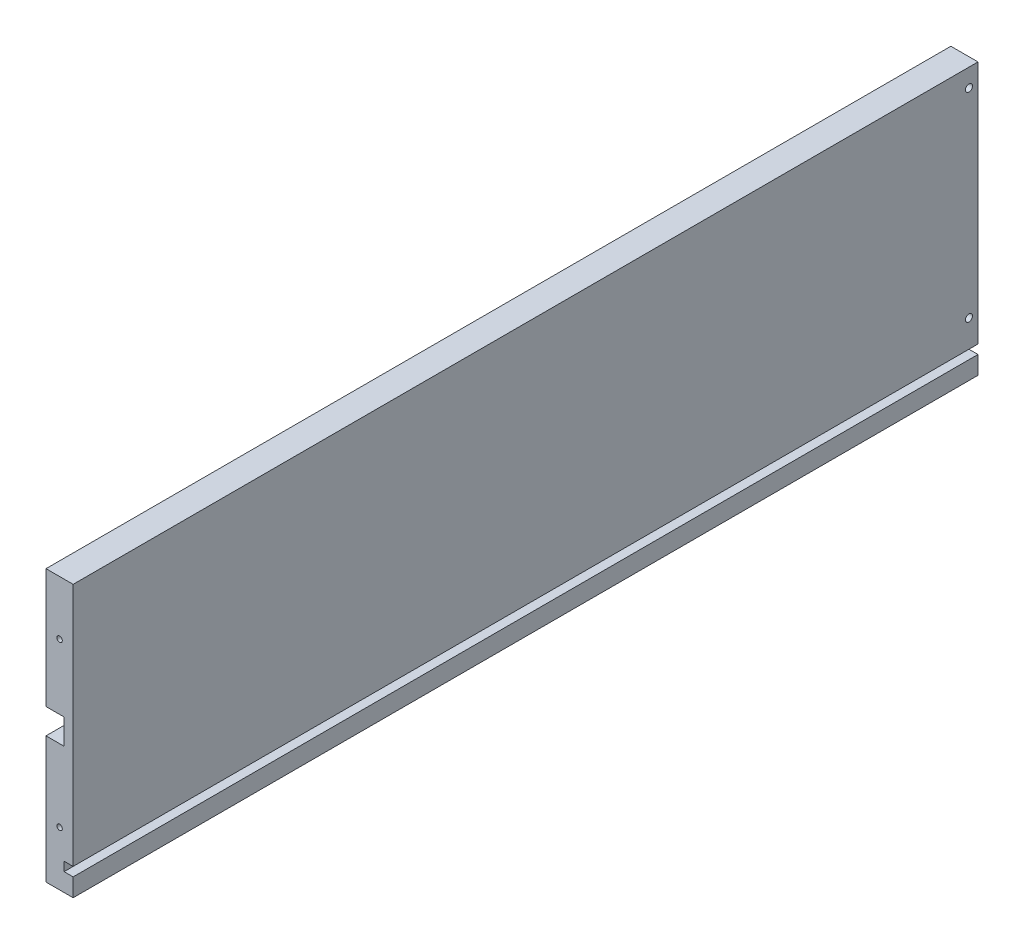
ISO-10303-21;
HEADER;
FILE_DESCRIPTION(('STEP AP214'),'2;1');
FILE_NAME('part.step','',(''),(''),'','','');
FILE_SCHEMA(('AUTOMOTIVE_DESIGN { 1 0 10303 214 1 1 1 1 }'));
ENDSEC;
DATA;
#1=APPLICATION_CONTEXT('core data for automotive mechanical design processes');
#2=APPLICATION_PROTOCOL_DEFINITION('international standard','automotive_design',2000,#1);
#3=PRODUCT_CONTEXT('',#1,'mechanical');
#4=PRODUCT('Part','Part','',(#3));
#5=PRODUCT_RELATED_PRODUCT_CATEGORY('part','',(#4));
#6=PRODUCT_DEFINITION_FORMATION('','',#4);
#7=PRODUCT_DEFINITION_CONTEXT('part definition',#1,'design');
#8=PRODUCT_DEFINITION('design','',#6,#7);
#9=PRODUCT_DEFINITION_SHAPE('','',#8);
#10=(LENGTH_UNIT() NAMED_UNIT(*) SI_UNIT(.MILLI.,.METRE.));
#11=(NAMED_UNIT(*) PLANE_ANGLE_UNIT() SI_UNIT($,.RADIAN.));
#12=(NAMED_UNIT(*) SI_UNIT($,.STERADIAN.) SOLID_ANGLE_UNIT());
#13=UNCERTAINTY_MEASURE_WITH_UNIT(LENGTH_MEASURE(1.E-05),#10,'distance_accuracy_value','');
#14=(GEOMETRIC_REPRESENTATION_CONTEXT(3) GLOBAL_UNCERTAINTY_ASSIGNED_CONTEXT((#13)) GLOBAL_UNIT_ASSIGNED_CONTEXT((#10,
#11,#12)) REPRESENTATION_CONTEXT('',''));
#15=CARTESIAN_POINT('',(0.,0.,0.));
#16=DIRECTION('',(0.,0.,1.));
#17=DIRECTION('',(1.,0.,0.));
#18=AXIS2_PLACEMENT_3D('',#15,#16,#17);
#19=CARTESIAN_POINT('',(15.,150.,0.));
#20=DIRECTION('',(1.,0.,0.));
#21=DIRECTION('',(0.,0.,1.));
#22=AXIS2_PLACEMENT_3D('',#19,#20,#21);
#23=PLANE('',#22);
#24=CARTESIAN_POINT('',(15.,140.,-495.));
#25=DIRECTION('',(1.,0.,0.));
#26=DIRECTION('',(0.,0.,-1.));
#27=AXIS2_PLACEMENT_3D('',#24,#25,#26);
#28=CIRCLE('',#27,1.95000000000001);
#29=CARTESIAN_POINT('',(15.,140.,-496.95));
#30=VERTEX_POINT('',#29);
#31=EDGE_CURVE('E152',#30,#30,#28,.T.);
#32=ORIENTED_EDGE('',*,*,#31,.F.);
#33=EDGE_LOOP('',(#32));
#34=FACE_BOUND('',#33,.T.);
#35=CARTESIAN_POINT('',(15.,30.,-495.));
#36=DIRECTION('',(1.,0.,0.));
#37=DIRECTION('',(0.,0.,-1.));
#38=AXIS2_PLACEMENT_3D('',#35,#36,#37);
#39=CIRCLE('',#38,1.94999999999999);
#40=CARTESIAN_POINT('',(15.,30.,-496.95));
#41=VERTEX_POINT('',#40);
#42=EDGE_CURVE('E161',#41,#41,#39,.T.);
#43=ORIENTED_EDGE('',*,*,#42,.F.);
#44=EDGE_LOOP('',(#43));
#45=FACE_BOUND('',#44,.T.);
#46=DIRECTION('',(0.,0.,1.));
#47=VECTOR('',#46,1.);
#48=CARTESIAN_POINT('',(15.,15.,-500.));
#49=LINE('',#48,#47);
#50=CARTESIAN_POINT('',(15.,15.,-500.));
#51=VERTEX_POINT('',#50);
#52=CARTESIAN_POINT('',(15.,15.,0.));
#53=VERTEX_POINT('',#52);
#54=EDGE_CURVE('E185',#51,#53,#49,.T.);
#55=ORIENTED_EDGE('',*,*,#54,.F.);
#56=DIRECTION('',(0.,1.,0.));
#57=VECTOR('',#56,1.);
#58=CARTESIAN_POINT('',(15.,0.,-500.));
#59=LINE('',#58,#57);
#60=CARTESIAN_POINT('',(15.,150.,-500.));
#61=VERTEX_POINT('',#60);
#62=EDGE_CURVE('E223',#51,#61,#59,.T.);
#63=ORIENTED_EDGE('',*,*,#62,.T.);
#64=DIRECTION('',(0.,0.,1.));
#65=VECTOR('',#64,1.);
#66=CARTESIAN_POINT('',(15.,150.,0.));
#67=LINE('',#66,#65);
#68=CARTESIAN_POINT('',(15.,150.,0.));
#69=VERTEX_POINT('',#68);
#70=EDGE_CURVE('E226',#61,#69,#67,.T.);
#71=ORIENTED_EDGE('',*,*,#70,.T.);
#72=DIRECTION('',(0.,-1.,0.));
#73=VECTOR('',#72,1.);
#74=CARTESIAN_POINT('',(15.,0.,0.));
#75=LINE('',#74,#73);
#76=EDGE_CURVE('E217',#69,#53,#75,.T.);
#77=ORIENTED_EDGE('',*,*,#76,.T.);
#78=EDGE_LOOP('',(#55,#63,#71,#77));
#79=FACE_BOUND('',#78,.T.);
#80=ADVANCED_FACE('F35',(#34,#45,#79),#23,.T.);
#81=CARTESIAN_POINT('',(0.,150.,0.));
#82=DIRECTION('',(1.,0.,0.));
#83=DIRECTION('',(0.,0.,1.));
#84=AXIS2_PLACEMENT_3D('',#81,#82,#83);
#85=PLANE('',#84);
#86=CARTESIAN_POINT('',(0.,30.,-495.));
#87=DIRECTION('',(1.,0.,0.));
#88=DIRECTION('',(0.,0.,-1.));
#89=AXIS2_PLACEMENT_3D('',#86,#87,#88);
#90=CIRCLE('',#89,4.1);
#91=CARTESIAN_POINT('',(0.,30.,-499.1));
#92=VERTEX_POINT('',#91);
#93=EDGE_CURVE('E167',#92,#92,#90,.T.);
#94=ORIENTED_EDGE('',*,*,#93,.T.);
#95=EDGE_LOOP('',(#94));
#96=FACE_BOUND('',#95,.T.);
#97=DIRECTION('',(0.,1.,0.));
#98=VECTOR('',#97,1.);
#99=CARTESIAN_POINT('',(0.,0.,-500.));
#100=LINE('',#99,#98);
#101=CARTESIAN_POINT('',(0.,0.,-500.));
#102=VERTEX_POINT('',#101);
#103=CARTESIAN_POINT('',(0.,70.,-500.));
#104=VERTEX_POINT('',#103);
#105=EDGE_CURVE('E236',#102,#104,#100,.T.);
#106=ORIENTED_EDGE('',*,*,#105,.F.);
#107=DIRECTION('',(0.,0.,-1.));
#108=VECTOR('',#107,1.);
#109=CARTESIAN_POINT('',(0.,0.,0.));
#110=LINE('',#109,#108);
#111=CARTESIAN_POINT('',(0.,0.,0.));
#112=VERTEX_POINT('',#111);
#113=EDGE_CURVE('E232',#112,#102,#110,.T.);
#114=ORIENTED_EDGE('',*,*,#113,.F.);
#115=DIRECTION('',(0.,-1.,0.));
#116=VECTOR('',#115,1.);
#117=CARTESIAN_POINT('',(0.,0.,0.));
#118=LINE('',#117,#116);
#119=CARTESIAN_POINT('',(0.,70.,0.));
#120=VERTEX_POINT('',#119);
#121=EDGE_CURVE('E211',#120,#112,#118,.T.);
#122=ORIENTED_EDGE('',*,*,#121,.F.);
#123=DIRECTION('',(0.,0.,1.));
#124=VECTOR('',#123,1.);
#125=CARTESIAN_POINT('',(0.,70.,-500.));
#126=LINE('',#125,#124);
#127=EDGE_CURVE('E208',#104,#120,#126,.T.);
#128=ORIENTED_EDGE('',*,*,#127,.F.);
#129=EDGE_LOOP('',(#106,#114,#122,#128));
#130=FACE_BOUND('',#129,.T.);
#131=ADVANCED_FACE('F259',(#96,#130),#85,.F.);
#132=CARTESIAN_POINT('',(15.,0.,0.));
#133=DIRECTION('',(0.,0.,1.));
#134=DIRECTION('',(-1.,0.,0.));
#135=AXIS2_PLACEMENT_3D('',#132,#133,#134);
#136=PLANE('',#135);
#137=CARTESIAN_POINT('',(7.5,30.,0.));
#138=DIRECTION('',(0.,0.,-1.));
#139=DIRECTION('',(-1.,0.,0.));
#140=AXIS2_PLACEMENT_3D('',#137,#138,#139);
#141=CIRCLE('',#140,1.5);
#142=CARTESIAN_POINT('',(6.00000000000001,30.,0.));
#143=VERTEX_POINT('',#142);
#144=EDGE_CURVE('E141',#143,#143,#141,.T.);
#145=ORIENTED_EDGE('',*,*,#144,.T.);
#146=EDGE_LOOP('',(#145));
#147=FACE_BOUND('',#146,.T.);
#148=CARTESIAN_POINT('',(7.50000000000001,120.,0.));
#149=DIRECTION('',(0.,0.,-1.));
#150=DIRECTION('',(-1.,0.,0.));
#151=AXIS2_PLACEMENT_3D('',#148,#149,#150);
#152=CIRCLE('',#151,1.5);
#153=CARTESIAN_POINT('',(6.00000000000002,120.,0.));
#154=VERTEX_POINT('',#153);
#155=EDGE_CURVE('E149',#154,#154,#152,.T.);
#156=ORIENTED_EDGE('',*,*,#155,.T.);
#157=EDGE_LOOP('',(#156));
#158=FACE_BOUND('',#157,.T.);
#159=DIRECTION('',(1.,0.,0.));
#160=VECTOR('',#159,1.);
#161=CARTESIAN_POINT('',(15.,15.,0.));
#162=LINE('',#161,#160);
#163=CARTESIAN_POINT('',(10.,15.,0.));
#164=VERTEX_POINT('',#163);
#165=EDGE_CURVE('E174',#164,#53,#162,.T.);
#166=ORIENTED_EDGE('',*,*,#165,.T.);
#167=ORIENTED_EDGE('',*,*,#76,.F.);
#168=DIRECTION('',(-1.,0.,0.));
#169=VECTOR('',#168,1.);
#170=CARTESIAN_POINT('',(15.,150.,0.));
#171=LINE('',#170,#169);
#172=CARTESIAN_POINT('',(0.,150.,0.));
#173=VERTEX_POINT('',#172);
#174=EDGE_CURVE('E11',#69,#173,#171,.T.);
#175=ORIENTED_EDGE('',*,*,#174,.T.);
#176=CARTESIAN_POINT('',(0.,84.,0.));
#177=VERTEX_POINT('',#176);
#178=EDGE_CURVE('E229',#173,#177,#118,.T.);
#179=ORIENTED_EDGE('',*,*,#178,.T.);
#180=DIRECTION('',(1.,0.,0.));
#181=VECTOR('',#180,1.);
#182=CARTESIAN_POINT('',(0.,84.,0.));
#183=LINE('',#182,#181);
#184=CARTESIAN_POINT('',(10.,84.,0.));
#185=VERTEX_POINT('',#184);
#186=EDGE_CURVE('E188',#177,#185,#183,.T.);
#187=ORIENTED_EDGE('',*,*,#186,.T.);
#188=DIRECTION('',(0.,-1.,0.));
#189=VECTOR('',#188,1.);
#190=CARTESIAN_POINT('',(10.,70.,0.));
#191=LINE('',#190,#189);
#192=CARTESIAN_POINT('',(10.,70.,0.));
#193=VERTEX_POINT('',#192);
#194=EDGE_CURVE('E204',#185,#193,#191,.T.);
#195=ORIENTED_EDGE('',*,*,#194,.T.);
#196=DIRECTION('',(-1.,0.,0.));
#197=VECTOR('',#196,1.);
#198=CARTESIAN_POINT('',(0.,70.,0.));
#199=LINE('',#198,#197);
#200=EDGE_CURVE('E197',#193,#120,#199,.T.);
#201=ORIENTED_EDGE('',*,*,#200,.T.);
#202=ORIENTED_EDGE('',*,*,#121,.T.);
#203=DIRECTION('',(-1.,0.,0.));
#204=VECTOR('',#203,1.);
#205=CARTESIAN_POINT('',(15.,0.,0.));
#206=LINE('',#205,#204);
#207=CARTESIAN_POINT('',(15.,0.,0.));
#208=VERTEX_POINT('',#207);
#209=EDGE_CURVE('E39',#208,#112,#206,.T.);
#210=ORIENTED_EDGE('',*,*,#209,.F.);
#211=CARTESIAN_POINT('',(15.,10.,0.));
#212=VERTEX_POINT('',#211);
#213=EDGE_CURVE('E221',#212,#208,#75,.T.);
#214=ORIENTED_EDGE('',*,*,#213,.F.);
#215=DIRECTION('',(-1.,0.,0.));
#216=VECTOR('',#215,1.);
#217=CARTESIAN_POINT('',(15.,10.,0.));
#218=LINE('',#217,#216);
#219=CARTESIAN_POINT('',(10.,10.,0.));
#220=VERTEX_POINT('',#219);
#221=EDGE_CURVE('E170',#212,#220,#218,.T.);
#222=ORIENTED_EDGE('',*,*,#221,.T.);
#223=DIRECTION('',(0.,1.,0.));
#224=VECTOR('',#223,1.);
#225=CARTESIAN_POINT('',(10.,10.,0.));
#226=LINE('',#225,#224);
#227=EDGE_CURVE('E181',#220,#164,#226,.T.);
#228=ORIENTED_EDGE('',*,*,#227,.T.);
#229=EDGE_LOOP('',(#166,#167,#175,#179,#187,#195,#201,#202,#210,#214,#222,#228));
#230=FACE_BOUND('',#229,.T.);
#231=ADVANCED_FACE('F37',(#147,#158,#230),#136,.T.);
#232=CARTESIAN_POINT('',(15.,150.,0.));
#233=DIRECTION('',(0.,1.,0.));
#234=DIRECTION('',(0.,0.,1.));
#235=AXIS2_PLACEMENT_3D('',#232,#233,#234);
#236=PLANE('',#235);
#237=DIRECTION('',(0.,0.,1.));
#238=VECTOR('',#237,1.);
#239=CARTESIAN_POINT('',(0.,150.,0.));
#240=LINE('',#239,#238);
#241=CARTESIAN_POINT('',(0.,150.,-500.));
#242=VERTEX_POINT('',#241);
#243=EDGE_CURVE('E239',#242,#173,#240,.T.);
#244=ORIENTED_EDGE('',*,*,#243,.T.);
#245=ORIENTED_EDGE('',*,*,#174,.F.);
#246=ORIENTED_EDGE('',*,*,#70,.F.);
#247=DIRECTION('',(-1.,0.,0.));
#248=VECTOR('',#247,1.);
#249=CARTESIAN_POINT('',(15.,150.,-500.));
#250=LINE('',#249,#248);
#251=EDGE_CURVE('E44',#61,#242,#250,.T.);
#252=ORIENTED_EDGE('',*,*,#251,.T.);
#253=EDGE_LOOP('',(#244,#245,#246,#252));
#254=FACE_BOUND('',#253,.T.);
#255=ADVANCED_FACE('F276',(#254),#236,.T.);
#256=CARTESIAN_POINT('',(15.,0.,-500.));
#257=DIRECTION('',(0.,0.,-1.));
#258=DIRECTION('',(1.,0.,0.));
#259=AXIS2_PLACEMENT_3D('',#256,#257,#258);
#260=PLANE('',#259);
#261=DIRECTION('',(1.,0.,0.));
#262=VECTOR('',#261,1.);
#263=CARTESIAN_POINT('',(15.,15.,-500.));
#264=LINE('',#263,#262);
#265=CARTESIAN_POINT('',(10.,15.,-500.));
#266=VERTEX_POINT('',#265);
#267=EDGE_CURVE('E177',#266,#51,#264,.T.);
#268=ORIENTED_EDGE('',*,*,#267,.F.);
#269=DIRECTION('',(0.,1.,0.));
#270=VECTOR('',#269,1.);
#271=CARTESIAN_POINT('',(10.,10.,-500.));
#272=LINE('',#271,#270);
#273=CARTESIAN_POINT('',(10.,10.,-500.));
#274=VERTEX_POINT('',#273);
#275=EDGE_CURVE('E173',#274,#266,#272,.T.);
#276=ORIENTED_EDGE('',*,*,#275,.F.);
#277=DIRECTION('',(-1.,0.,0.));
#278=VECTOR('',#277,1.);
#279=CARTESIAN_POINT('',(15.,10.,-500.));
#280=LINE('',#279,#278);
#281=CARTESIAN_POINT('',(15.,10.,-500.));
#282=VERTEX_POINT('',#281);
#283=EDGE_CURVE('E171',#282,#274,#280,.T.);
#284=ORIENTED_EDGE('',*,*,#283,.F.);
#285=CARTESIAN_POINT('',(15.,0.,-500.));
#286=VERTEX_POINT('',#285);
#287=EDGE_CURVE('E224',#286,#282,#59,.T.);
#288=ORIENTED_EDGE('',*,*,#287,.F.);
#289=DIRECTION('',(-1.,0.,0.));
#290=VECTOR('',#289,1.);
#291=CARTESIAN_POINT('',(15.,0.,-500.));
#292=LINE('',#291,#290);
#293=EDGE_CURVE('E242',#286,#102,#292,.T.);
#294=ORIENTED_EDGE('',*,*,#293,.T.);
#295=ORIENTED_EDGE('',*,*,#105,.T.);
#296=DIRECTION('',(-1.,0.,0.));
#297=VECTOR('',#296,1.);
#298=CARTESIAN_POINT('',(0.,70.,-500.));
#299=LINE('',#298,#297);
#300=CARTESIAN_POINT('',(10.,70.,-500.));
#301=VERTEX_POINT('',#300);
#302=EDGE_CURVE('E200',#301,#104,#299,.T.);
#303=ORIENTED_EDGE('',*,*,#302,.F.);
#304=DIRECTION('',(0.,-1.,0.));
#305=VECTOR('',#304,1.);
#306=CARTESIAN_POINT('',(10.,70.,-500.));
#307=LINE('',#306,#305);
#308=CARTESIAN_POINT('',(10.,84.,-500.));
#309=VERTEX_POINT('',#308);
#310=EDGE_CURVE('E196',#309,#301,#307,.T.);
#311=ORIENTED_EDGE('',*,*,#310,.F.);
#312=DIRECTION('',(1.,0.,0.));
#313=VECTOR('',#312,1.);
#314=CARTESIAN_POINT('',(0.,84.,-500.));
#315=LINE('',#314,#313);
#316=CARTESIAN_POINT('',(0.,84.,-500.));
#317=VERTEX_POINT('',#316);
#318=EDGE_CURVE('E194',#317,#309,#315,.T.);
#319=ORIENTED_EDGE('',*,*,#318,.F.);
#320=EDGE_CURVE('E235',#317,#242,#100,.T.);
#321=ORIENTED_EDGE('',*,*,#320,.T.);
#322=ORIENTED_EDGE('',*,*,#251,.F.);
#323=ORIENTED_EDGE('',*,*,#62,.F.);
#324=EDGE_LOOP('',(#268,#276,#284,#288,#294,#295,#303,#311,#319,#321,#322,#323));
#325=FACE_BOUND('',#324,.T.);
#326=ADVANCED_FACE('F262',(#325),#260,.T.);
#327=CARTESIAN_POINT('',(15.,0.,0.));
#328=DIRECTION('',(0.,-1.,0.));
#329=DIRECTION('',(0.,0.,-1.));
#330=AXIS2_PLACEMENT_3D('',#327,#328,#329);
#331=PLANE('',#330);
#332=ORIENTED_EDGE('',*,*,#113,.T.);
#333=ORIENTED_EDGE('',*,*,#293,.F.);
#334=DIRECTION('',(0.,0.,-1.));
#335=VECTOR('',#334,1.);
#336=CARTESIAN_POINT('',(15.,0.,0.));
#337=LINE('',#336,#335);
#338=EDGE_CURVE('E220',#208,#286,#337,.T.);
#339=ORIENTED_EDGE('',*,*,#338,.F.);
#340=ORIENTED_EDGE('',*,*,#209,.T.);
#341=EDGE_LOOP('',(#332,#333,#339,#340));
#342=FACE_BOUND('',#341,.T.);
#343=ADVANCED_FACE('F249',(#342),#331,.T.);
#344=DIRECTION('',(0.,0.,1.));
#345=VECTOR('',#344,1.);
#346=CARTESIAN_POINT('',(15.,10.,-500.));
#347=LINE('',#346,#345);
#348=EDGE_CURVE('E52',#282,#212,#347,.T.);
#349=ORIENTED_EDGE('',*,*,#348,.T.);
#350=ORIENTED_EDGE('',*,*,#213,.T.);
#351=ORIENTED_EDGE('',*,*,#338,.T.);
#352=ORIENTED_EDGE('',*,*,#287,.T.);
#353=EDGE_LOOP('',(#349,#350,#351,#352));
#354=FACE_BOUND('',#353,.T.);
#355=ADVANCED_FACE('F293',(#354),#23,.T.);
#356=CARTESIAN_POINT('',(0.,140.,-495.));
#357=DIRECTION('',(1.,0.,0.));
#358=DIRECTION('',(0.,0.,-1.));
#359=AXIS2_PLACEMENT_3D('',#356,#357,#358);
#360=CIRCLE('',#359,4.09999999999999);
#361=CARTESIAN_POINT('',(0.,140.,-499.1));
#362=VERTEX_POINT('',#361);
#363=EDGE_CURVE('E158',#362,#362,#360,.T.);
#364=ORIENTED_EDGE('',*,*,#363,.T.);
#365=EDGE_LOOP('',(#364));
#366=FACE_BOUND('',#365,.T.);
#367=ORIENTED_EDGE('',*,*,#178,.F.);
#368=ORIENTED_EDGE('',*,*,#243,.F.);
#369=ORIENTED_EDGE('',*,*,#320,.F.);
#370=DIRECTION('',(0.,0.,1.));
#371=VECTOR('',#370,1.);
#372=CARTESIAN_POINT('',(0.,84.,-500.));
#373=LINE('',#372,#371);
#374=EDGE_CURVE('E60',#317,#177,#373,.T.);
#375=ORIENTED_EDGE('',*,*,#374,.T.);
#376=EDGE_LOOP('',(#367,#368,#369,#375));
#377=FACE_BOUND('',#376,.T.);
#378=ADVANCED_FACE('F279',(#366,#377),#85,.F.);
#379=CARTESIAN_POINT('',(0.,70.,-500.));
#380=DIRECTION('',(0.,-1.,0.));
#381=DIRECTION('',(0.,0.,-1.));
#382=AXIS2_PLACEMENT_3D('',#379,#380,#381);
#383=PLANE('',#382);
#384=ORIENTED_EDGE('',*,*,#200,.F.);
#385=DIRECTION('',(0.,0.,1.));
#386=VECTOR('',#385,1.);
#387=CARTESIAN_POINT('',(10.,70.,-500.));
#388=LINE('',#387,#386);
#389=EDGE_CURVE('E212',#301,#193,#388,.T.);
#390=ORIENTED_EDGE('',*,*,#389,.F.);
#391=ORIENTED_EDGE('',*,*,#302,.T.);
#392=ORIENTED_EDGE('',*,*,#127,.T.);
#393=EDGE_LOOP('',(#384,#390,#391,#392));
#394=FACE_BOUND('',#393,.T.);
#395=ADVANCED_FACE('F266',(#394),#383,.F.);
#396=CARTESIAN_POINT('',(10.,70.,-500.));
#397=DIRECTION('',(1.,0.,0.));
#398=DIRECTION('',(0.,0.,1.));
#399=AXIS2_PLACEMENT_3D('',#396,#397,#398);
#400=PLANE('',#399);
#401=ORIENTED_EDGE('',*,*,#194,.F.);
#402=DIRECTION('',(0.,0.,1.));
#403=VECTOR('',#402,1.);
#404=CARTESIAN_POINT('',(10.,84.,-500.));
#405=LINE('',#404,#403);
#406=EDGE_CURVE('E214',#309,#185,#405,.T.);
#407=ORIENTED_EDGE('',*,*,#406,.F.);
#408=ORIENTED_EDGE('',*,*,#310,.T.);
#409=ORIENTED_EDGE('',*,*,#389,.T.);
#410=EDGE_LOOP('',(#401,#407,#408,#409));
#411=FACE_BOUND('',#410,.T.);
#412=ADVANCED_FACE('F269',(#411),#400,.F.);
#413=CARTESIAN_POINT('',(0.,84.,-500.));
#414=DIRECTION('',(0.,1.,0.));
#415=DIRECTION('',(0.,0.,1.));
#416=AXIS2_PLACEMENT_3D('',#413,#414,#415);
#417=PLANE('',#416);
#418=ORIENTED_EDGE('',*,*,#186,.F.);
#419=ORIENTED_EDGE('',*,*,#374,.F.);
#420=ORIENTED_EDGE('',*,*,#318,.T.);
#421=ORIENTED_EDGE('',*,*,#406,.T.);
#422=EDGE_LOOP('',(#418,#419,#420,#421));
#423=FACE_BOUND('',#422,.T.);
#424=ADVANCED_FACE('F270',(#423),#417,.F.);
#425=CARTESIAN_POINT('',(15.,15.,-500.));
#426=DIRECTION('',(0.,1.,0.));
#427=DIRECTION('',(0.,0.,1.));
#428=AXIS2_PLACEMENT_3D('',#425,#426,#427);
#429=PLANE('',#428);
#430=ORIENTED_EDGE('',*,*,#165,.F.);
#431=DIRECTION('',(0.,0.,1.));
#432=VECTOR('',#431,1.);
#433=CARTESIAN_POINT('',(10.,15.,-500.));
#434=LINE('',#433,#432);
#435=EDGE_CURVE('E189',#266,#164,#434,.T.);
#436=ORIENTED_EDGE('',*,*,#435,.F.);
#437=ORIENTED_EDGE('',*,*,#267,.T.);
#438=ORIENTED_EDGE('',*,*,#54,.T.);
#439=EDGE_LOOP('',(#430,#436,#437,#438));
#440=FACE_BOUND('',#439,.T.);
#441=ADVANCED_FACE('F287',(#440),#429,.F.);
#442=CARTESIAN_POINT('',(10.,10.,-500.));
#443=DIRECTION('',(-1.,0.,0.));
#444=DIRECTION('',(0.,0.,-1.));
#445=AXIS2_PLACEMENT_3D('',#442,#443,#444);
#446=PLANE('',#445);
#447=ORIENTED_EDGE('',*,*,#227,.F.);
#448=DIRECTION('',(0.,0.,1.));
#449=VECTOR('',#448,1.);
#450=CARTESIAN_POINT('',(10.,10.,-500.));
#451=LINE('',#450,#449);
#452=EDGE_CURVE('E191',#274,#220,#451,.T.);
#453=ORIENTED_EDGE('',*,*,#452,.F.);
#454=ORIENTED_EDGE('',*,*,#275,.T.);
#455=ORIENTED_EDGE('',*,*,#435,.T.);
#456=EDGE_LOOP('',(#447,#453,#454,#455));
#457=FACE_BOUND('',#456,.T.);
#458=ADVANCED_FACE('F290',(#457),#446,.F.);
#459=CARTESIAN_POINT('',(15.,10.,-500.));
#460=DIRECTION('',(0.,-1.,0.));
#461=DIRECTION('',(-1.,0.,0.));
#462=AXIS2_PLACEMENT_3D('',#459,#460,#461);
#463=PLANE('',#462);
#464=ORIENTED_EDGE('',*,*,#221,.F.);
#465=ORIENTED_EDGE('',*,*,#348,.F.);
#466=ORIENTED_EDGE('',*,*,#283,.T.);
#467=ORIENTED_EDGE('',*,*,#452,.T.);
#468=EDGE_LOOP('',(#464,#465,#466,#467));
#469=FACE_BOUND('',#468,.T.);
#470=ADVANCED_FACE('F291',(#469),#463,.F.);
#471=CARTESIAN_POINT('',(0.,30.,-495.));
#472=DIRECTION('',(-1.,0.,0.));
#473=DIRECTION('',(0.,0.,-1.));
#474=AXIS2_PLACEMENT_3D('',#471,#472,#473);
#475=CONICAL_SURFACE('',#474,4.1,0.785398163397448);
#476=CARTESIAN_POINT('',(2.15,30.,-495.));
#477=DIRECTION('',(1.,0.,0.));
#478=DIRECTION('',(0.,0.,-1.));
#479=AXIS2_PLACEMENT_3D('',#476,#477,#478);
#480=CIRCLE('',#479,1.95);
#481=CARTESIAN_POINT('',(2.15,30.,-496.95));
#482=VERTEX_POINT('',#481);
#483=EDGE_CURVE('E164',#482,#482,#480,.T.);
#484=ORIENTED_EDGE('',*,*,#483,.T.);
#485=EDGE_LOOP('',(#484));
#486=FACE_BOUND('',#485,.T.);
#487=ORIENTED_EDGE('',*,*,#93,.F.);
#488=EDGE_LOOP('',(#487));
#489=FACE_BOUND('',#488,.T.);
#490=ADVANCED_FACE('F317',(#486,#489),#475,.F.);
#491=CARTESIAN_POINT('',(0.,30.,-495.));
#492=DIRECTION('',(-1.,0.,0.));
#493=DIRECTION('',(0.,0.,-1.));
#494=AXIS2_PLACEMENT_3D('',#491,#492,#493);
#495=CYLINDRICAL_SURFACE('',#494,1.95);
#496=ORIENTED_EDGE('',*,*,#42,.T.);
#497=EDGE_LOOP('',(#496));
#498=FACE_BOUND('',#497,.T.);
#499=ORIENTED_EDGE('',*,*,#483,.F.);
#500=EDGE_LOOP('',(#499));
#501=FACE_BOUND('',#500,.T.);
#502=ADVANCED_FACE('F313',(#498,#501),#495,.F.);
#503=CARTESIAN_POINT('',(0.,140.,-495.));
#504=DIRECTION('',(-1.,0.,0.));
#505=DIRECTION('',(0.,0.,-1.));
#506=AXIS2_PLACEMENT_3D('',#503,#504,#505);
#507=CONICAL_SURFACE('',#506,4.09999999999999,0.785398163397445);
#508=CARTESIAN_POINT('',(2.15,140.,-495.));
#509=DIRECTION('',(1.,0.,0.));
#510=DIRECTION('',(0.,0.,-1.));
#511=AXIS2_PLACEMENT_3D('',#508,#509,#510);
#512=CIRCLE('',#511,1.95000000000001);
#513=CARTESIAN_POINT('',(2.15,140.,-496.95));
#514=VERTEX_POINT('',#513);
#515=EDGE_CURVE('E155',#514,#514,#512,.T.);
#516=ORIENTED_EDGE('',*,*,#515,.T.);
#517=EDGE_LOOP('',(#516));
#518=FACE_BOUND('',#517,.T.);
#519=ORIENTED_EDGE('',*,*,#363,.F.);
#520=EDGE_LOOP('',(#519));
#521=FACE_BOUND('',#520,.T.);
#522=ADVANCED_FACE('F316',(#518,#521),#507,.F.);
#523=CARTESIAN_POINT('',(0.,140.,-495.));
#524=DIRECTION('',(-1.,0.,0.));
#525=DIRECTION('',(0.,0.,-1.));
#526=AXIS2_PLACEMENT_3D('',#523,#524,#525);
#527=CYLINDRICAL_SURFACE('',#526,1.95000000000001);
#528=ORIENTED_EDGE('',*,*,#31,.T.);
#529=EDGE_LOOP('',(#528));
#530=FACE_BOUND('',#529,.T.);
#531=ORIENTED_EDGE('',*,*,#515,.F.);
#532=EDGE_LOOP('',(#531));
#533=FACE_BOUND('',#532,.T.);
#534=ADVANCED_FACE('F374',(#530,#533),#527,.F.);
#535=CARTESIAN_POINT('',(7.50000000000001,120.,0.));
#536=DIRECTION('',(0.,0.,1.));
#537=DIRECTION('',(-1.,0.,0.));
#538=AXIS2_PLACEMENT_3D('',#535,#536,#537);
#539=CYLINDRICAL_SURFACE('',#538,1.5);
#540=CARTESIAN_POINT('',(7.50000000000001,120.,-10.));
#541=DIRECTION('',(0.,0.,-1.));
#542=DIRECTION('',(-1.,0.,0.));
#543=AXIS2_PLACEMENT_3D('',#540,#541,#542);
#544=CIRCLE('',#543,1.5);
#545=CARTESIAN_POINT('',(6.00000000000002,120.,-10.));
#546=VERTEX_POINT('',#545);
#547=EDGE_CURVE('E144',#546,#546,#544,.T.);
#548=ORIENTED_EDGE('',*,*,#547,.T.);
#549=EDGE_LOOP('',(#548));
#550=FACE_BOUND('',#549,.T.);
#551=ORIENTED_EDGE('',*,*,#155,.F.);
#552=EDGE_LOOP('',(#551));
#553=FACE_BOUND('',#552,.T.);
#554=ADVANCED_FACE('F383',(#550,#553),#539,.F.);
#555=CARTESIAN_POINT('',(7.50000000000001,120.,-10.));
#556=DIRECTION('',(0.,0.,1.));
#557=DIRECTION('',(-1.,0.,0.));
#558=AXIS2_PLACEMENT_3D('',#555,#556,#557);
#559=CONICAL_SURFACE('',#558,1.5,1.02974425867665);
#560=CARTESIAN_POINT('',(7.50000000000002,120.,-10.9012909285413));
#561=VERTEX_POINT('',#560);
#562=VERTEX_LOOP('',#561);
#563=FACE_BOUND('',#562,.T.);
#564=ORIENTED_EDGE('',*,*,#547,.F.);
#565=EDGE_LOOP('',(#564));
#566=FACE_BOUND('',#565,.T.);
#567=ADVANCED_FACE('F393',(#563,#566),#559,.F.);
#568=CARTESIAN_POINT('',(7.5,30.,0.));
#569=DIRECTION('',(0.,0.,1.));
#570=DIRECTION('',(-1.,0.,0.));
#571=AXIS2_PLACEMENT_3D('',#568,#569,#570);
#572=CYLINDRICAL_SURFACE('',#571,1.5);
#573=CARTESIAN_POINT('',(7.5,30.,-10.));
#574=DIRECTION('',(0.,0.,-1.));
#575=DIRECTION('',(-1.,0.,0.));
#576=AXIS2_PLACEMENT_3D('',#573,#574,#575);
#577=CIRCLE('',#576,1.5);
#578=CARTESIAN_POINT('',(6.00000000000001,30.,-10.));
#579=VERTEX_POINT('',#578);
#580=EDGE_CURVE('E139',#579,#579,#577,.T.);
#581=ORIENTED_EDGE('',*,*,#580,.T.);
#582=EDGE_LOOP('',(#581));
#583=FACE_BOUND('',#582,.T.);
#584=ORIENTED_EDGE('',*,*,#144,.F.);
#585=EDGE_LOOP('',(#584));
#586=FACE_BOUND('',#585,.T.);
#587=ADVANCED_FACE('F135',(#583,#586),#572,.F.);
#588=CARTESIAN_POINT('',(7.5,30.,-10.));
#589=DIRECTION('',(0.,0.,1.));
#590=DIRECTION('',(-1.,0.,0.));
#591=AXIS2_PLACEMENT_3D('',#588,#589,#590);
#592=CONICAL_SURFACE('',#591,1.5,1.02974425867665);
#593=CARTESIAN_POINT('',(7.50000000000001,30.,-10.9012909285413));
#594=VERTEX_POINT('',#593);
#595=VERTEX_LOOP('',#594);
#596=FACE_BOUND('',#595,.T.);
#597=ORIENTED_EDGE('',*,*,#580,.F.);
#598=EDGE_LOOP('',(#597));
#599=FACE_BOUND('',#598,.T.);
#600=ADVANCED_FACE('F132',(#596,#599),#592,.F.);
#601=CLOSED_SHELL('',(#80,#131,#231,#255,#326,#343,#355,#378,#395,#412,#424,#441,#458,#470,#490,
#502,#522,#534,#554,#567,#587,#600));
#602=MANIFOLD_SOLID_BREP('B2',#601);
#603=ADVANCED_BREP_SHAPE_REPRESENTATION('',(#18,#602),#14);
#604=SHAPE_DEFINITION_REPRESENTATION(#9,#603);
ENDSEC;
END-ISO-10303-21;
